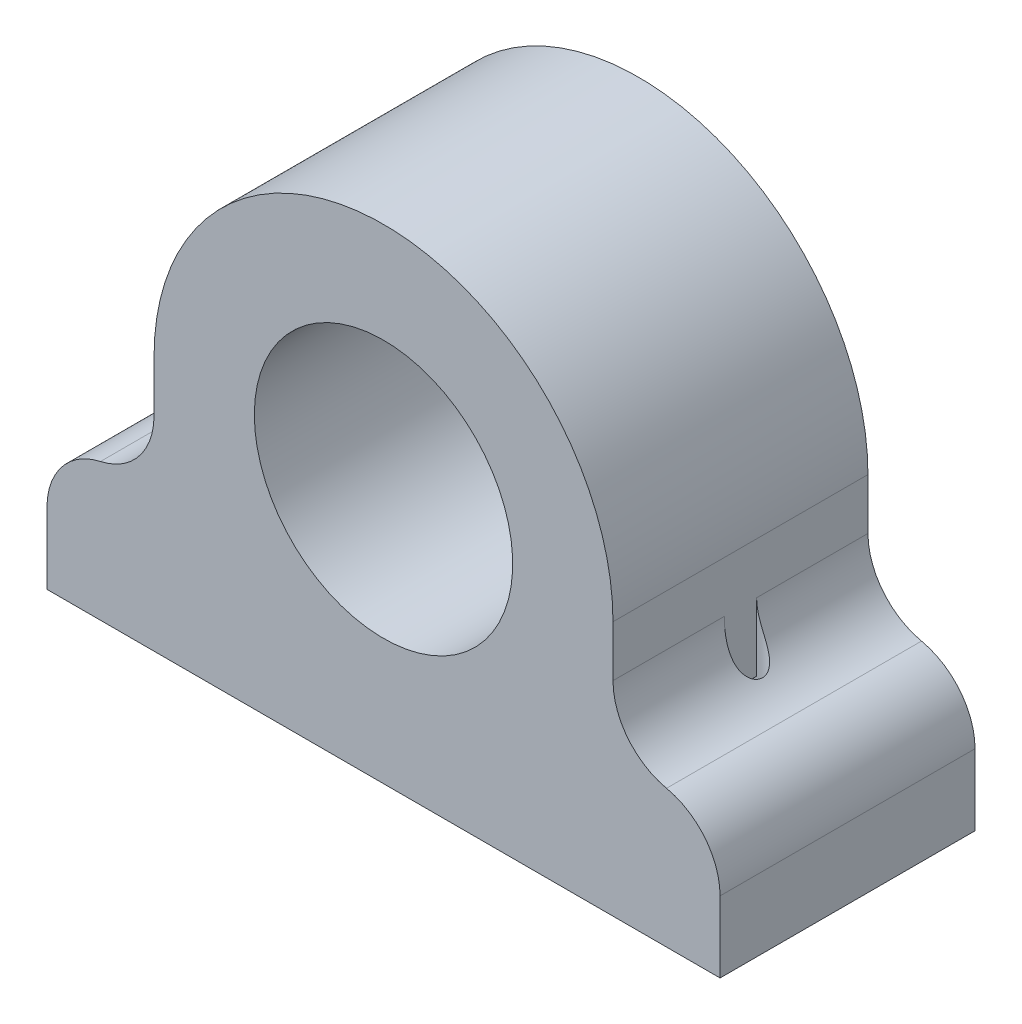
ISO-10303-21;
HEADER;
FILE_DESCRIPTION(('STEP AP214'),'2;1');
FILE_NAME('part.step','',(''),(''),'','','');
FILE_SCHEMA(('AUTOMOTIVE_DESIGN { 1 0 10303 214 1 1 1 1 }'));
ENDSEC;
DATA;
#1=APPLICATION_CONTEXT('core data for automotive mechanical design processes');
#2=APPLICATION_PROTOCOL_DEFINITION('international standard','automotive_design',2000,#1);
#3=PRODUCT_CONTEXT('',#1,'mechanical');
#4=PRODUCT('Part','Part','',(#3));
#5=PRODUCT_RELATED_PRODUCT_CATEGORY('part','',(#4));
#6=PRODUCT_DEFINITION_FORMATION('','',#4);
#7=PRODUCT_DEFINITION_CONTEXT('part definition',#1,'design');
#8=PRODUCT_DEFINITION('design','',#6,#7);
#9=PRODUCT_DEFINITION_SHAPE('','',#8);
#10=(LENGTH_UNIT() NAMED_UNIT(*) SI_UNIT(.MILLI.,.METRE.));
#11=(NAMED_UNIT(*) PLANE_ANGLE_UNIT() SI_UNIT($,.RADIAN.));
#12=(NAMED_UNIT(*) SI_UNIT($,.STERADIAN.) SOLID_ANGLE_UNIT());
#13=UNCERTAINTY_MEASURE_WITH_UNIT(LENGTH_MEASURE(1.E-05),#10,'distance_accuracy_value','');
#14=(GEOMETRIC_REPRESENTATION_CONTEXT(3) GLOBAL_UNCERTAINTY_ASSIGNED_CONTEXT((#13)) GLOBAL_UNIT_ASSIGNED_CONTEXT((#10,
#11,#12)) REPRESENTATION_CONTEXT('',''));
#15=CARTESIAN_POINT('',(0.,0.,0.));
#16=DIRECTION('',(0.,0.,1.));
#17=DIRECTION('',(1.,0.,0.));
#18=AXIS2_PLACEMENT_3D('',#15,#16,#17);
#19=CARTESIAN_POINT('',(0.,0.,9.525));
#20=DIRECTION('',(0.,0.,-1.));
#21=DIRECTION('',(-1.,0.,0.));
#22=AXIS2_PLACEMENT_3D('',#19,#20,#21);
#23=CYLINDRICAL_SURFACE('',#22,8.5725);
#24=CARTESIAN_POINT('',(0.,0.,0.));
#25=DIRECTION('',(0.,0.,1.));
#26=DIRECTION('',(-1.,0.,0.));
#27=AXIS2_PLACEMENT_3D('',#24,#25,#26);
#28=CIRCLE('',#27,8.5725);
#29=CARTESIAN_POINT('',(8.5725,0.,0.));
#30=VERTEX_POINT('',#29);
#31=CARTESIAN_POINT('',(-8.5725,0.,0.));
#32=VERTEX_POINT('',#31);
#33=EDGE_CURVE('E165',#30,#32,#28,.T.);
#34=ORIENTED_EDGE('',*,*,#33,.T.);
#35=DIRECTION('',(0.,0.,-1.));
#36=VECTOR('',#35,1.);
#37=CARTESIAN_POINT('',(-8.5725,0.,9.525));
#38=LINE('',#37,#36);
#39=CARTESIAN_POINT('',(-8.5725,0.,9.525));
#40=VERTEX_POINT('',#39);
#41=EDGE_CURVE('E183',#40,#32,#38,.T.);
#42=ORIENTED_EDGE('',*,*,#41,.F.);
#43=CARTESIAN_POINT('',(0.,0.,9.525));
#44=DIRECTION('',(0.,0.,1.));
#45=DIRECTION('',(-1.,0.,0.));
#46=AXIS2_PLACEMENT_3D('',#43,#44,#45);
#47=CIRCLE('',#46,8.5725);
#48=CARTESIAN_POINT('',(8.5725,0.,9.525));
#49=VERTEX_POINT('',#48);
#50=EDGE_CURVE('E161',#49,#40,#47,.T.);
#51=ORIENTED_EDGE('',*,*,#50,.F.);
#52=DIRECTION('',(0.,0.,-1.));
#53=VECTOR('',#52,1.);
#54=CARTESIAN_POINT('',(8.5725,0.,9.525));
#55=LINE('',#54,#53);
#56=EDGE_CURVE('E158',#49,#30,#55,.T.);
#57=ORIENTED_EDGE('',*,*,#56,.T.);
#58=EDGE_LOOP('',(#34,#42,#51,#57));
#59=FACE_BOUND('',#58,.T.);
#60=ADVANCED_FACE('F32',(#59),#23,.T.);
#61=CARTESIAN_POINT('',(-8.5725,0.,9.525));
#62=DIRECTION('',(1.,0.,0.));
#63=DIRECTION('',(0.,1.,0.));
#64=AXIS2_PLACEMENT_3D('',#61,#62,#63);
#65=PLANE('',#64);
#66=DIRECTION('',(0.,0.,1.));
#67=VECTOR('',#66,1.);
#68=CARTESIAN_POINT('',(-8.5725,-1.905,2.07837430355012));
#69=LINE('',#68,#67);
#70=CARTESIAN_POINT('',(-8.5725,-1.90500190223585,0.));
#71=VERTEX_POINT('',#70);
#72=CARTESIAN_POINT('',(-8.5725,-1.9050038044717,4.15674860710024));
#73=VERTEX_POINT('',#72);
#74=EDGE_CURVE('E202',#71,#73,#69,.T.);
#75=ORIENTED_EDGE('',*,*,#74,.T.);
#76=DIRECTION('',(0.,1.,0.));
#77=VECTOR('',#76,1.);
#78=CARTESIAN_POINT('',(-8.5725,-1.9050038044717,4.15674860710024));
#79=LINE('',#78,#77);
#80=CARTESIAN_POINT('',(-8.5725,-4.445,4.15674860710024));
#81=VERTEX_POINT('',#80);
#82=EDGE_CURVE('E205',#73,#81,#79,.F.);
#83=ORIENTED_EDGE('',*,*,#82,.T.);
#84=DIRECTION('',(0.,0.,-1.));
#85=VECTOR('',#84,1.);
#86=CARTESIAN_POINT('',(-8.5725,-4.445,9.525));
#87=LINE('',#86,#85);
#88=CARTESIAN_POINT('',(-8.5725,-4.445,5.36825139289976));
#89=VERTEX_POINT('',#88);
#90=EDGE_CURVE('E180',#89,#81,#87,.T.);
#91=ORIENTED_EDGE('',*,*,#90,.F.);
#92=DIRECTION('',(0.,1.,0.));
#93=VECTOR('',#92,1.);
#94=CARTESIAN_POINT('',(-8.5725,-4.445,5.36825139289976));
#95=LINE('',#94,#93);
#96=CARTESIAN_POINT('',(-8.5725,-1.905,5.36825139289976));
#97=VERTEX_POINT('',#96);
#98=EDGE_CURVE('E199',#89,#97,#95,.T.);
#99=ORIENTED_EDGE('',*,*,#98,.T.);
#100=DIRECTION('',(0.,0.,-1.));
#101=VECTOR('',#100,1.);
#102=CARTESIAN_POINT('',(-8.5725,-1.905,9.525));
#103=LINE('',#102,#101);
#104=CARTESIAN_POINT('',(-8.5725,-1.905,9.525));
#105=VERTEX_POINT('',#104);
#106=EDGE_CURVE('E197',#97,#105,#103,.F.);
#107=ORIENTED_EDGE('',*,*,#106,.T.);
#108=DIRECTION('',(0.,-1.,0.));
#109=VECTOR('',#108,1.);
#110=CARTESIAN_POINT('',(-8.5725,0.,9.525));
#111=LINE('',#110,#109);
#112=EDGE_CURVE('E156',#40,#105,#111,.T.);
#113=ORIENTED_EDGE('',*,*,#112,.F.);
#114=ORIENTED_EDGE('',*,*,#41,.T.);
#115=DIRECTION('',(0.,-1.,0.));
#116=VECTOR('',#115,1.);
#117=CARTESIAN_POINT('',(-8.5725,0.,0.));
#118=LINE('',#117,#116);
#119=EDGE_CURVE('E168',#32,#71,#118,.T.);
#120=ORIENTED_EDGE('',*,*,#119,.T.);
#121=EDGE_LOOP('',(#75,#83,#91,#99,#107,#113,#114,#120));
#122=FACE_BOUND('',#121,.T.);
#123=ADVANCED_FACE('F277',(#122),#65,.F.);
#124=CARTESIAN_POINT('',(-18.7325,-9.525,9.525));
#125=DIRECTION('',(0.,1.,0.));
#126=DIRECTION('',(0.,0.,1.));
#127=AXIS2_PLACEMENT_3D('',#124,#125,#126);
#128=PLANE('',#127);
#129=CARTESIAN_POINT('',(8.763,-9.525,4.7625));
#130=DIRECTION('',(0.,1.,0.));
#131=DIRECTION('',(-1.,0.,0.));
#132=AXIS2_PLACEMENT_3D('',#129,#130,#131);
#133=CIRCLE('',#132,0.635000000000001);
#134=CARTESIAN_POINT('',(8.128,-9.525,4.7625));
#135=VERTEX_POINT('',#134);
#136=EDGE_CURVE('E297',#135,#135,#133,.T.);
#137=ORIENTED_EDGE('',*,*,#136,.T.);
#138=EDGE_LOOP('',(#137));
#139=FACE_BOUND('',#138,.T.);
#140=CARTESIAN_POINT('',(-8.763,-9.52500000000001,4.7625));
#141=DIRECTION('',(0.,1.,0.));
#142=DIRECTION('',(-1.,0.,0.));
#143=AXIS2_PLACEMENT_3D('',#140,#141,#142);
#144=CIRCLE('',#143,0.635000000000001);
#145=CARTESIAN_POINT('',(-9.398,-9.52500000000001,4.7625));
#146=VERTEX_POINT('',#145);
#147=EDGE_CURVE('E296',#146,#146,#144,.T.);
#148=ORIENTED_EDGE('',*,*,#147,.T.);
#149=EDGE_LOOP('',(#148));
#150=FACE_BOUND('',#149,.T.);
#151=DIRECTION('',(1.,0.,0.));
#152=VECTOR('',#151,1.);
#153=CARTESIAN_POINT('',(-18.7325,-9.525,0.));
#154=LINE('',#153,#152);
#155=CARTESIAN_POINT('',(-12.573,-9.525,0.));
#156=VERTEX_POINT('',#155);
#157=CARTESIAN_POINT('',(12.573,-9.525,0.));
#158=VERTEX_POINT('',#157);
#159=EDGE_CURVE('E150',#156,#158,#154,.T.);
#160=ORIENTED_EDGE('',*,*,#159,.T.);
#161=DIRECTION('',(0.,0.,-1.));
#162=VECTOR('',#161,1.);
#163=CARTESIAN_POINT('',(12.573,-9.525,11.6569279405596));
#164=LINE('',#163,#162);
#165=CARTESIAN_POINT('',(12.573,-9.525,9.525));
#166=VERTEX_POINT('',#165);
#167=EDGE_CURVE('E135',#166,#158,#164,.T.);
#168=ORIENTED_EDGE('',*,*,#167,.F.);
#169=DIRECTION('',(1.,0.,0.));
#170=VECTOR('',#169,1.);
#171=CARTESIAN_POINT('',(-18.7325,-9.525,9.525));
#172=LINE('',#171,#170);
#173=CARTESIAN_POINT('',(-12.573,-9.525,9.525));
#174=VERTEX_POINT('',#173);
#175=EDGE_CURVE('E148',#174,#166,#172,.T.);
#176=ORIENTED_EDGE('',*,*,#175,.F.);
#177=DIRECTION('',(0.,0.,1.));
#178=VECTOR('',#177,1.);
#179=CARTESIAN_POINT('',(-12.573,-9.525,11.6569279405596));
#180=LINE('',#179,#178);
#181=EDGE_CURVE('E141',#156,#174,#180,.T.);
#182=ORIENTED_EDGE('',*,*,#181,.F.);
#183=EDGE_LOOP('',(#160,#168,#176,#182));
#184=FACE_BOUND('',#183,.T.);
#185=ADVANCED_FACE('F146',(#139,#150,#184),#128,.F.);
#186=CARTESIAN_POINT('',(8.5725,-4.445,9.525));
#187=DIRECTION('',(-1.,0.,0.));
#188=DIRECTION('',(0.,-1.,0.));
#189=AXIS2_PLACEMENT_3D('',#186,#187,#188);
#190=PLANE('',#189);
#191=DIRECTION('',(0.,1.,0.));
#192=VECTOR('',#191,1.);
#193=CARTESIAN_POINT('',(8.5725,-4.445,4.15674860710024));
#194=LINE('',#193,#192);
#195=CARTESIAN_POINT('',(8.5725,-4.445,4.15674860710024));
#196=VERTEX_POINT('',#195);
#197=CARTESIAN_POINT('',(8.5725,-1.905,4.15674860710024));
#198=VERTEX_POINT('',#197);
#199=EDGE_CURVE('E191',#196,#198,#194,.T.);
#200=ORIENTED_EDGE('',*,*,#199,.T.);
#201=DIRECTION('',(0.,0.,-1.));
#202=VECTOR('',#201,1.);
#203=CARTESIAN_POINT('',(8.5725,-1.905,0.));
#204=LINE('',#203,#202);
#205=CARTESIAN_POINT('',(8.5725,-1.905,0.));
#206=VERTEX_POINT('',#205);
#207=EDGE_CURVE('E194',#198,#206,#204,.T.);
#208=ORIENTED_EDGE('',*,*,#207,.T.);
#209=DIRECTION('',(0.,1.,0.));
#210=VECTOR('',#209,1.);
#211=CARTESIAN_POINT('',(8.5725,-4.445,0.));
#212=LINE('',#211,#210);
#213=EDGE_CURVE('E173',#206,#30,#212,.T.);
#214=ORIENTED_EDGE('',*,*,#213,.T.);
#215=ORIENTED_EDGE('',*,*,#56,.F.);
#216=DIRECTION('',(0.,1.,0.));
#217=VECTOR('',#216,1.);
#218=CARTESIAN_POINT('',(8.5725,-4.445,9.525));
#219=LINE('',#218,#217);
#220=CARTESIAN_POINT('',(8.5725,-1.9050019022359,9.525));
#221=VERTEX_POINT('',#220);
#222=EDGE_CURVE('E155',#221,#49,#219,.T.);
#223=ORIENTED_EDGE('',*,*,#222,.F.);
#224=DIRECTION('',(0.,0.,1.));
#225=VECTOR('',#224,1.);
#226=CARTESIAN_POINT('',(8.5725,-1.905,7.44662569644988));
#227=LINE('',#226,#225);
#228=CARTESIAN_POINT('',(8.5725,-1.9050038044718,5.36825139289976));
#229=VERTEX_POINT('',#228);
#230=EDGE_CURVE('E186',#221,#229,#227,.F.);
#231=ORIENTED_EDGE('',*,*,#230,.T.);
#232=DIRECTION('',(0.,1.,0.));
#233=VECTOR('',#232,1.);
#234=CARTESIAN_POINT('',(8.5725,-1.9050038044718,5.36825139289976));
#235=LINE('',#234,#233);
#236=CARTESIAN_POINT('',(8.5725,-4.445,5.36825139289976));
#237=VERTEX_POINT('',#236);
#238=EDGE_CURVE('E189',#229,#237,#235,.F.);
#239=ORIENTED_EDGE('',*,*,#238,.T.);
#240=DIRECTION('',(0.,0.,-1.));
#241=VECTOR('',#240,1.);
#242=CARTESIAN_POINT('',(8.5725,-4.445,9.525));
#243=LINE('',#242,#241);
#244=EDGE_CURVE('E177',#237,#196,#243,.T.);
#245=ORIENTED_EDGE('',*,*,#244,.T.);
#246=EDGE_LOOP('',(#200,#208,#214,#215,#223,#231,#239,#245));
#247=FACE_BOUND('',#246,.T.);
#248=ADVANCED_FACE('F268',(#247),#190,.F.);
#249=CARTESIAN_POINT('',(0.,0.,9.525));
#250=DIRECTION('',(0.,0.,-1.));
#251=DIRECTION('',(-1.,0.,0.));
#252=AXIS2_PLACEMENT_3D('',#249,#250,#251);
#253=PLANE('',#252);
#254=CARTESIAN_POINT('',(0.,0.,9.525));
#255=DIRECTION('',(0.,0.,-1.));
#256=DIRECTION('',(-1.,0.,0.));
#257=AXIS2_PLACEMENT_3D('',#254,#255,#256);
#258=CIRCLE('',#257,4.826);
#259=CARTESIAN_POINT('',(-4.826,0.,9.525));
#260=VERTEX_POINT('',#259);
#261=EDGE_CURVE('E307',#260,#260,#258,.T.);
#262=ORIENTED_EDGE('',*,*,#261,.T.);
#263=EDGE_LOOP('',(#262));
#264=FACE_BOUND('',#263,.T.);
#265=DIRECTION('',(0.,1.,0.));
#266=VECTOR('',#265,1.);
#267=CARTESIAN_POINT('',(12.573,0.,9.525));
#268=LINE('',#267,#266);
#269=CARTESIAN_POINT('',(12.573,-6.86897821812304,9.525));
#270=VERTEX_POINT('',#269);
#271=EDGE_CURVE('E131',#166,#270,#268,.T.);
#272=ORIENTED_EDGE('',*,*,#271,.T.);
#273=CARTESIAN_POINT('',(10.033,-6.86897821812304,9.525));
#274=DIRECTION('',(0.,0.,-1.));
#275=DIRECTION('',(-1.,0.,0.));
#276=AXIS2_PLACEMENT_3D('',#273,#274,#275);
#277=CIRCLE('',#276,2.54);
#278=CARTESIAN_POINT('',(10.57275,-4.38698910906152,9.525));
#279=VERTEX_POINT('',#278);
#280=EDGE_CURVE('E327',#270,#279,#277,.F.);
#281=ORIENTED_EDGE('',*,*,#280,.T.);
#282=CARTESIAN_POINT('',(11.1125,-1.905,9.525));
#283=DIRECTION('',(0.,0.,-1.));
#284=DIRECTION('',(-1.,0.,0.));
#285=AXIS2_PLACEMENT_3D('',#282,#283,#284);
#286=CIRCLE('',#285,2.54);
#287=EDGE_CURVE('E210',#279,#221,#286,.T.);
#288=ORIENTED_EDGE('',*,*,#287,.T.);
#289=ORIENTED_EDGE('',*,*,#222,.T.);
#290=ORIENTED_EDGE('',*,*,#50,.T.);
#291=ORIENTED_EDGE('',*,*,#112,.T.);
#292=CARTESIAN_POINT('',(-11.1125,-1.905,9.525));
#293=DIRECTION('',(0.,0.,-1.));
#294=DIRECTION('',(-1.,0.,0.));
#295=AXIS2_PLACEMENT_3D('',#292,#293,#294);
#296=CIRCLE('',#295,2.54);
#297=CARTESIAN_POINT('',(-10.57275,-4.38698910906152,9.525));
#298=VERTEX_POINT('',#297);
#299=EDGE_CURVE('E244',#105,#298,#296,.T.);
#300=ORIENTED_EDGE('',*,*,#299,.T.);
#301=CARTESIAN_POINT('',(-10.033,-6.86897821812304,9.525));
#302=DIRECTION('',(0.,0.,-1.));
#303=DIRECTION('',(-1.,0.,0.));
#304=AXIS2_PLACEMENT_3D('',#301,#302,#303);
#305=CIRCLE('',#304,2.54);
#306=CARTESIAN_POINT('',(-12.573,-6.86897821812304,9.525));
#307=VERTEX_POINT('',#306);
#308=EDGE_CURVE('E47',#298,#307,#305,.F.);
#309=ORIENTED_EDGE('',*,*,#308,.T.);
#310=DIRECTION('',(0.,-1.,0.));
#311=VECTOR('',#310,1.);
#312=CARTESIAN_POINT('',(-12.573,0.,9.525));
#313=LINE('',#312,#311);
#314=EDGE_CURVE('E153',#307,#174,#313,.T.);
#315=ORIENTED_EDGE('',*,*,#314,.T.);
#316=ORIENTED_EDGE('',*,*,#175,.T.);
#317=EDGE_LOOP('',(#272,#281,#288,#289,#290,#291,#300,#309,#315,#316));
#318=FACE_BOUND('',#317,.T.);
#319=ADVANCED_FACE('F152',(#264,#318),#253,.F.);
#320=CARTESIAN_POINT('',(0.,0.,0.));
#321=DIRECTION('',(0.,0.,-1.));
#322=DIRECTION('',(-1.,0.,0.));
#323=AXIS2_PLACEMENT_3D('',#320,#321,#322);
#324=PLANE('',#323);
#325=CARTESIAN_POINT('',(11.1125,-1.905,0.));
#326=DIRECTION('',(0.,0.,-1.));
#327=DIRECTION('',(-1.,0.,0.));
#328=AXIS2_PLACEMENT_3D('',#325,#326,#327);
#329=CIRCLE('',#328,2.54);
#330=CARTESIAN_POINT('',(10.57275,-4.38698910906152,0.));
#331=VERTEX_POINT('',#330);
#332=EDGE_CURVE('E207',#206,#331,#329,.F.);
#333=ORIENTED_EDGE('',*,*,#332,.T.);
#334=CARTESIAN_POINT('',(10.033,-6.86897821812304,0.));
#335=DIRECTION('',(0.,0.,-1.));
#336=DIRECTION('',(-1.,0.,0.));
#337=AXIS2_PLACEMENT_3D('',#334,#335,#336);
#338=CIRCLE('',#337,2.54);
#339=CARTESIAN_POINT('',(12.573,-6.86897821812304,0.));
#340=VERTEX_POINT('',#339);
#341=EDGE_CURVE('E332',#331,#340,#338,.T.);
#342=ORIENTED_EDGE('',*,*,#341,.T.);
#343=DIRECTION('',(0.,1.,0.));
#344=VECTOR('',#343,1.);
#345=CARTESIAN_POINT('',(12.573,0.,0.));
#346=LINE('',#345,#344);
#347=EDGE_CURVE('E338',#158,#340,#346,.T.);
#348=ORIENTED_EDGE('',*,*,#347,.F.);
#349=ORIENTED_EDGE('',*,*,#159,.F.);
#350=DIRECTION('',(0.,-1.,0.));
#351=VECTOR('',#350,1.);
#352=CARTESIAN_POINT('',(-12.573,0.,0.));
#353=LINE('',#352,#351);
#354=CARTESIAN_POINT('',(-12.573,-6.86897821812304,0.));
#355=VERTEX_POINT('',#354);
#356=EDGE_CURVE('E339',#355,#156,#353,.T.);
#357=ORIENTED_EDGE('',*,*,#356,.F.);
#358=CARTESIAN_POINT('',(-10.033,-6.86897821812304,0.));
#359=DIRECTION('',(0.,0.,-1.));
#360=DIRECTION('',(-1.,0.,0.));
#361=AXIS2_PLACEMENT_3D('',#358,#359,#360);
#362=CIRCLE('',#361,2.54);
#363=CARTESIAN_POINT('',(-10.57275,-4.38698910906152,0.));
#364=VERTEX_POINT('',#363);
#365=EDGE_CURVE('E326',#355,#364,#362,.T.);
#366=ORIENTED_EDGE('',*,*,#365,.T.);
#367=CARTESIAN_POINT('',(-11.1125,-1.905,0.));
#368=DIRECTION('',(0.,0.,-1.));
#369=DIRECTION('',(-1.,0.,0.));
#370=AXIS2_PLACEMENT_3D('',#367,#368,#369);
#371=CIRCLE('',#370,2.54);
#372=EDGE_CURVE('E219',#364,#71,#371,.F.);
#373=ORIENTED_EDGE('',*,*,#372,.T.);
#374=ORIENTED_EDGE('',*,*,#119,.F.);
#375=ORIENTED_EDGE('',*,*,#33,.F.);
#376=ORIENTED_EDGE('',*,*,#213,.F.);
#377=EDGE_LOOP('',(#333,#342,#348,#349,#357,#366,#373,#374,#375,#376));
#378=FACE_BOUND('',#377,.T.);
#379=CARTESIAN_POINT('',(0.,0.,0.));
#380=DIRECTION('',(0.,0.,-1.));
#381=DIRECTION('',(-1.,0.,0.));
#382=AXIS2_PLACEMENT_3D('',#379,#380,#381);
#383=CIRCLE('',#382,6.4135);
#384=CARTESIAN_POINT('',(-6.4135,0.,0.));
#385=VERTEX_POINT('',#384);
#386=EDGE_CURVE('E310',#385,#385,#383,.T.);
#387=ORIENTED_EDGE('',*,*,#386,.F.);
#388=EDGE_LOOP('',(#387));
#389=FACE_BOUND('',#388,.T.);
#390=ADVANCED_FACE('F264',(#378,#389),#324,.T.);
#391=CARTESIAN_POINT('',(0.,0.,1.5875));
#392=DIRECTION('',(0.,0.,-1.));
#393=DIRECTION('',(-1.,0.,0.));
#394=AXIS2_PLACEMENT_3D('',#391,#392,#393);
#395=CYLINDRICAL_SURFACE('',#394,6.4135);
#396=CARTESIAN_POINT('',(0.,0.,1.5875));
#397=DIRECTION('',(0.,0.,-1.));
#398=DIRECTION('',(-1.,0.,0.));
#399=AXIS2_PLACEMENT_3D('',#396,#397,#398);
#400=CIRCLE('',#399,6.4135);
#401=CARTESIAN_POINT('',(-6.4135,0.,1.5875));
#402=VERTEX_POINT('',#401);
#403=EDGE_CURVE('E169',#402,#402,#400,.T.);
#404=ORIENTED_EDGE('',*,*,#403,.F.);
#405=EDGE_LOOP('',(#404));
#406=FACE_BOUND('',#405,.T.);
#407=ORIENTED_EDGE('',*,*,#386,.T.);
#408=EDGE_LOOP('',(#407));
#409=FACE_BOUND('',#408,.T.);
#410=ADVANCED_FACE('F260',(#406,#409),#395,.F.);
#411=CARTESIAN_POINT('',(0.,0.,1.5875));
#412=DIRECTION('',(0.,0.,-1.));
#413=DIRECTION('',(-1.,0.,0.));
#414=AXIS2_PLACEMENT_3D('',#411,#412,#413);
#415=PLANE('',#414);
#416=CARTESIAN_POINT('',(0.,0.,1.5875));
#417=DIRECTION('',(0.,0.,-1.));
#418=DIRECTION('',(-1.,0.,0.));
#419=AXIS2_PLACEMENT_3D('',#416,#417,#418);
#420=CIRCLE('',#419,4.826);
#421=CARTESIAN_POINT('',(-4.826,0.,1.5875));
#422=VERTEX_POINT('',#421);
#423=EDGE_CURVE('E300',#422,#422,#420,.T.);
#424=ORIENTED_EDGE('',*,*,#423,.F.);
#425=EDGE_LOOP('',(#424));
#426=FACE_BOUND('',#425,.T.);
#427=ORIENTED_EDGE('',*,*,#403,.T.);
#428=EDGE_LOOP('',(#427));
#429=FACE_BOUND('',#428,.T.);
#430=ADVANCED_FACE('F256',(#426,#429),#415,.T.);
#431=CARTESIAN_POINT('',(0.,0.,9.525));
#432=DIRECTION('',(0.,0.,-1.));
#433=DIRECTION('',(-1.,0.,0.));
#434=AXIS2_PLACEMENT_3D('',#431,#432,#433);
#435=CYLINDRICAL_SURFACE('',#434,4.826);
#436=ORIENTED_EDGE('',*,*,#261,.F.);
#437=EDGE_LOOP('',(#436));
#438=FACE_BOUND('',#437,.T.);
#439=ORIENTED_EDGE('',*,*,#423,.T.);
#440=EDGE_LOOP('',(#439));
#441=FACE_BOUND('',#440,.T.);
#442=ADVANCED_FACE('F253',(#438,#441),#435,.F.);
#443=CARTESIAN_POINT('',(-8.763,-4.445,4.7625));
#444=DIRECTION('',(0.,1.,0.));
#445=DIRECTION('',(-1.,0.,0.));
#446=AXIS2_PLACEMENT_3D('',#443,#444,#445);
#447=PLANE('',#446);
#448=CARTESIAN_POINT('',(-8.763,-4.445,4.7625));
#449=DIRECTION('',(0.,1.,0.));
#450=DIRECTION('',(-1.,0.,0.));
#451=AXIS2_PLACEMENT_3D('',#448,#449,#450);
#452=CIRCLE('',#451,0.635000000000001);
#453=EDGE_CURVE('E295',#89,#81,#452,.T.);
#454=ORIENTED_EDGE('',*,*,#453,.F.);
#455=ORIENTED_EDGE('',*,*,#90,.T.);
#456=EDGE_LOOP('',(#454,#455));
#457=FACE_BOUND('',#456,.T.);
#458=ADVANCED_FACE('F251',(#457),#447,.F.);
#459=CARTESIAN_POINT('',(-8.763,-9.52500000000001,4.7625));
#460=DIRECTION('',(0.,1.,0.));
#461=DIRECTION('',(-1.,0.,0.));
#462=AXIS2_PLACEMENT_3D('',#459,#460,#461);
#463=CYLINDRICAL_SURFACE('',#462,0.635000000000001);
#464=ORIENTED_EDGE('',*,*,#147,.F.);
#465=EDGE_LOOP('',(#464));
#466=FACE_BOUND('',#465,.T.);
#467=ORIENTED_EDGE('',*,*,#453,.T.);
#468=ORIENTED_EDGE('',*,*,#82,.F.);
#469=CARTESIAN_POINT('',(-8.5725,-1.9050038044717,4.15674860710024));
#470=CARTESIAN_POINT('',(-8.57249988677581,-1.93999750200674,4.1567532580896));
#471=CARTESIAN_POINT('',(-8.57322334750189,-1.97498681234913,4.1565206169252));
#472=CARTESIAN_POINT('',(-8.57611425737465,-2.04489708589561,4.15562100686838));
#473=CARTESIAN_POINT('',(-8.5782815773349,-2.07981805493407,4.1549540768332));
#474=CARTESIAN_POINT('',(-8.58694381556002,-2.18438683465711,4.15236244888043));
#475=CARTESIAN_POINT('',(-8.5955990142836,-2.2538522689427,4.14984688771824));
#476=CARTESIAN_POINT('',(-8.61869370126348,-2.39233719849741,4.14399976709207));
#477=CARTESIAN_POINT('',(-8.63317843103945,-2.46134881204359,4.14066190644435));
#478=CARTESIAN_POINT('',(-8.66782484257797,-2.59791346449246,4.13442750709579));
#479=CARTESIAN_POINT('',(-8.68798441935255,-2.66546703424684,4.13153080536735));
#480=CARTESIAN_POINT('',(-8.74043403340182,-2.81773301596061,4.12720526441434));
#481=CARTESIAN_POINT('',(-8.77454332148953,-2.90186392753383,4.12642781615542));
#482=CARTESIAN_POINT('',(-8.83213959461017,-3.02464164922766,4.1309864202533));
#483=CARTESIAN_POINT('',(-8.85237437398943,-3.06493842226591,4.13345191745408));
#484=CARTESIAN_POINT('',(-8.8948469194998,-3.14420681261746,4.14096376362402));
#485=CARTESIAN_POINT('',(-8.9170837300964,-3.1831790500016,4.14600888670674));
#486=CARTESIAN_POINT('',(-8.9688577116264,-3.26861633866458,4.16105182116498));
#487=CARTESIAN_POINT('',(-8.99886974608999,-3.3146469302622,4.17194493916606));
#488=CARTESIAN_POINT('',(-9.06073947708025,-3.40325948355183,4.20059629741526));
#489=CARTESIAN_POINT('',(-9.09259506211926,-3.4458452616836,4.21834681093574));
#490=CARTESIAN_POINT('',(-9.14802502378468,-3.51555029661399,4.25673683074094));
#491=CARTESIAN_POINT('',(-9.17156597435441,-3.5437851019324,4.27537728124539));
#492=CARTESIAN_POINT('',(-9.21762310401454,-3.59682364041218,4.31806240075403));
#493=CARTESIAN_POINT('',(-9.24014076988948,-3.62163246575304,4.34209890664156));
#494=CARTESIAN_POINT('',(-9.27797798899261,-3.66190675948129,4.3900223255516));
#495=CARTESIAN_POINT('',(-9.29379459519226,-3.67822892982098,4.41279166563101));
#496=CARTESIAN_POINT('',(-9.32298284396631,-3.70768073790458,4.46174343952413));
#497=CARTESIAN_POINT('',(-9.3363553173965,-3.72081146104799,4.48792470828675));
#498=CARTESIAN_POINT('',(-9.35980432261042,-3.74345806502858,4.54348997839502));
#499=CARTESIAN_POINT('',(-9.36985311205421,-3.75294362124381,4.57289833680984));
#500=CARTESIAN_POINT('',(-9.38562785683121,-3.76769482627628,4.63386189273106));
#501=CARTESIAN_POINT('',(-9.39135722977118,-3.77296381153025,4.66541537137932));
#502=CARTESIAN_POINT('',(-9.39750899990835,-3.77861144485791,4.72509560212473));
#503=CARTESIAN_POINT('',(-9.3985450924703,-3.7795558027071,4.75310762850362));
#504=CARTESIAN_POINT('',(-9.39691480113141,-3.7780640637388,4.80892721011076));
#505=CARTESIAN_POINT('',(-9.39424974901619,-3.7756291828755,4.83673483526989));
#506=CARTESIAN_POINT('',(-9.38565487946169,-3.76769616180962,4.88982218408501));
#507=CARTESIAN_POINT('',(-9.37990672976402,-3.76236828979798,4.91515763606461));
#508=CARTESIAN_POINT('',(-9.36563796307695,-3.748954550453,4.96425842206743));
#509=CARTESIAN_POINT('',(-9.35711718633507,-3.74086852419979,4.98802366552386));
#510=CARTESIAN_POINT('',(-9.33720648971063,-3.72162722244607,5.03489397954784));
#511=CARTESIAN_POINT('',(-9.32567582282869,-3.71031772752053,5.05787526092816));
#512=CARTESIAN_POINT('',(-9.30066918357337,-3.68522020124322,5.10127051761316));
#513=CARTESIAN_POINT('',(-9.2871921001895,-3.67143075322937,5.12168301412307));
#514=CARTESIAN_POINT('',(-9.25231494592385,-3.63479973164021,5.16870893883055));
#515=CARTESIAN_POINT('',(-9.23014317692759,-3.61072924156078,5.19379652189517));
#516=CARTESIAN_POINT('',(-9.18452161692394,-3.55899480271716,5.23849334610801));
#517=CARTESIAN_POINT('',(-9.16106929703879,-3.53132358230858,5.25809124130656));
#518=CARTESIAN_POINT('',(-9.10297115238463,-3.45947793501387,5.30053696052363));
#519=CARTESIAN_POINT('',(-9.06827176400784,-3.41368306789223,5.32054573269098));
#520=CARTESIAN_POINT('',(-9.00096260470065,-3.31796237991058,5.35240741848008));
#521=CARTESIAN_POINT('',(-8.96835716738094,-3.26802845272999,5.36424388278003));
#522=CARTESIAN_POINT('',(-8.9111150313003,-3.17310636119522,5.38058511626069));
#523=CARTESIAN_POINT('',(-8.8860218211762,-3.12852753359622,5.38593352428181));
#524=CARTESIAN_POINT('',(-8.83847105425716,-3.03770582162697,5.39345899002146));
#525=CARTESIAN_POINT('',(-8.81601536406829,-2.99146178865238,5.39563381404209));
#526=CARTESIAN_POINT('',(-8.77386929280904,-2.89750569403822,5.39775837817331));
#527=CARTESIAN_POINT('',(-8.75418856298007,-2.84978917979328,5.3977005358389));
#528=CARTESIAN_POINT('',(-8.71777452349914,-2.75326410975878,5.39614934182811));
#529=CARTESIAN_POINT('',(-8.70104187028405,-2.70445531347484,5.3946556709181));
#530=CARTESIAN_POINT('',(-8.66700024184668,-2.5943385279386,5.39048825549111));
#531=CARTESIAN_POINT('',(-8.65048246278825,-2.53279238054382,5.38761951332908));
#532=CARTESIAN_POINT('',(-8.62211629357394,-2.40863235062896,5.38184334658084));
#533=CARTESIAN_POINT('',(-8.61026846977704,-2.34601833956149,5.37893591734695));
#534=CARTESIAN_POINT('',(-8.59138189890182,-2.22052561722647,5.3739473454923));
#535=CARTESIAN_POINT('',(-8.58430639547545,-2.15765277103205,5.37185994040313));
#536=CARTESIAN_POINT('',(-8.57722550060672,-2.06306368580857,5.36972162479451));
#537=CARTESIAN_POINT('',(-8.57545392831216,-2.03148191451117,5.36917430958837));
#538=CARTESIAN_POINT('',(-8.57309110669265,-1.96826789013839,5.36843764387217));
#539=CARTESIAN_POINT('',(-8.57249994103039,-1.93663563364382,5.36824831873512));
#540=CARTESIAN_POINT('',(-8.57249999999999,-1.90499999999995,5.36825139290114));
#541=B_SPLINE_CURVE_WITH_KNOTS('',3,(#469,#470,#471,#472,#473,#474,#475,#476,#477,#478,#479,
#480,#481,#482,#483,#484,#485,#486,#487,#488,#489,#490,#491,#492,#493,#494,#495,#496,#497,#498,
#499,#500,#501,#502,#503,#504,#505,#506,#507,#508,#509,#510,#511,#512,#513,#514,#515,#516,#517,
#518,#519,#520,#521,#522,#523,#524,#525,#526,#527,#528,#529,#530,#531,#532,#533,#534,#535,#536,
#537,#538,#539,#540),.UNSPECIFIED.,.F.,.F.,(4,2,2,2,2,2,2,2,2,2,2,2,2,2,2,2,2,2,2,2,2,2,2,2,2,2,
2,2,2,2,2,2,2,2,2,4),(0.,0.104964307229694,0.209919224249367,0.419793924247354,
0.631329823086263,0.84278735944359,1.11435870409693,1.24972863944019,1.38503430416601,
1.55266719410491,1.7201117481776,1.84336156698293,1.96642617590695,2.06256907183226,
2.15867922401301,2.25557246011065,2.35238895169511,2.43609214967092,2.51976523646581,
2.59897655241172,2.67819243314193,2.76213014584448,2.84611596077799,2.96912616448134,
3.09238875769776,3.27388719970656,3.45574990726812,3.60983810492123,3.76403470391113,
3.9187550218923,4.07350974743023,4.26468638353074,4.45588619786459,4.64559604407505,
4.74048351887012,4.83537771868748),.UNSPECIFIED.);
#542=EDGE_CURVE('E238',#73,#97,#541,.T.);
#543=ORIENTED_EDGE('',*,*,#542,.T.);
#544=ORIENTED_EDGE('',*,*,#98,.F.);
#545=EDGE_LOOP('',(#467,#468,#543,#544));
#546=FACE_BOUND('',#545,.T.);
#547=ADVANCED_FACE('F246',(#466,#546),#463,.F.);
#548=CARTESIAN_POINT('',(8.763,-4.445,4.7625));
#549=DIRECTION('',(0.,1.,0.));
#550=DIRECTION('',(-1.,0.,0.));
#551=AXIS2_PLACEMENT_3D('',#548,#549,#550);
#552=PLANE('',#551);
#553=CARTESIAN_POINT('',(8.763,-4.445,4.7625));
#554=DIRECTION('',(0.,1.,0.));
#555=DIRECTION('',(-1.,0.,0.));
#556=AXIS2_PLACEMENT_3D('',#553,#554,#555);
#557=CIRCLE('',#556,0.635000000000001);
#558=EDGE_CURVE('E303',#196,#237,#557,.T.);
#559=ORIENTED_EDGE('',*,*,#558,.F.);
#560=ORIENTED_EDGE('',*,*,#244,.F.);
#561=EDGE_LOOP('',(#559,#560));
#562=FACE_BOUND('',#561,.T.);
#563=ADVANCED_FACE('F250',(#562),#552,.F.);
#564=CARTESIAN_POINT('',(8.763,-9.525,4.7625));
#565=DIRECTION('',(0.,1.,0.));
#566=DIRECTION('',(-1.,0.,0.));
#567=AXIS2_PLACEMENT_3D('',#564,#565,#566);
#568=CYLINDRICAL_SURFACE('',#567,0.635000000000001);
#569=ORIENTED_EDGE('',*,*,#136,.F.);
#570=EDGE_LOOP('',(#569));
#571=FACE_BOUND('',#570,.T.);
#572=ORIENTED_EDGE('',*,*,#558,.T.);
#573=ORIENTED_EDGE('',*,*,#238,.F.);
#574=CARTESIAN_POINT('',(8.5725,-1.9050038044718,5.36825139289976));
#575=CARTESIAN_POINT('',(8.57249988677581,-1.93999750200684,5.3682467419104));
#576=CARTESIAN_POINT('',(8.5732233475019,-1.97498681234923,5.3684793830748));
#577=CARTESIAN_POINT('',(8.57611425737465,-2.04489708589571,5.36937899313162));
#578=CARTESIAN_POINT('',(8.5782815773349,-2.07981805493417,5.3700459231668));
#579=CARTESIAN_POINT('',(8.58694381556003,-2.18438683465721,5.37263755111957));
#580=CARTESIAN_POINT('',(8.59559901428361,-2.2538522689428,5.37515311228177));
#581=CARTESIAN_POINT('',(8.6186937012635,-2.39233719849751,5.38100023290793));
#582=CARTESIAN_POINT('',(8.63317843103947,-2.46134881204369,5.38433809355565));
#583=CARTESIAN_POINT('',(8.667824842578,-2.59791346449256,5.39057249290422));
#584=CARTESIAN_POINT('',(8.68798441935258,-2.66546703424694,5.39346919463265));
#585=CARTESIAN_POINT('',(8.74043403340186,-2.8177330159607,5.39779473558566));
#586=CARTESIAN_POINT('',(8.77454332148957,-2.9018639275339,5.39857218384458));
#587=CARTESIAN_POINT('',(8.8321395946102,-3.02464164922772,5.3940135797467));
#588=CARTESIAN_POINT('',(8.85237437398946,-3.06493842226597,5.39154808254592));
#589=CARTESIAN_POINT('',(8.89484691949982,-3.1442068126175,5.38403623637597));
#590=CARTESIAN_POINT('',(8.91708373009643,-3.18317905000164,5.37899111329325));
#591=CARTESIAN_POINT('',(8.96885771162642,-3.26861633866461,5.36394817883501));
#592=CARTESIAN_POINT('',(8.99886974609001,-3.31464693026223,5.35305506083393));
#593=CARTESIAN_POINT('',(9.06073947708027,-3.40325948355186,5.32440370258473));
#594=CARTESIAN_POINT('',(9.09259506211928,-3.44584526168363,5.30665318906425));
#595=CARTESIAN_POINT('',(9.1480250237847,-3.51555029661402,5.26826316925904));
#596=CARTESIAN_POINT('',(9.17156597435443,-3.54378510193243,5.24962271875459));
#597=CARTESIAN_POINT('',(9.21762310401456,-3.5968236404122,5.20693759924595));
#598=CARTESIAN_POINT('',(9.24014076988949,-3.62163246575305,5.18290109335842));
#599=CARTESIAN_POINT('',(9.27797798899262,-3.6619067594813,5.13497767444838));
#600=CARTESIAN_POINT('',(9.29379459519227,-3.67822892982099,5.11220833436897));
#601=CARTESIAN_POINT('',(9.32298284396632,-3.70768073790459,5.06325656047585));
#602=CARTESIAN_POINT('',(9.33635531739651,-3.720811461048,5.03707529171323));
#603=CARTESIAN_POINT('',(9.35980432261043,-3.74345806502859,4.98151002160496));
#604=CARTESIAN_POINT('',(9.36985311205421,-3.75294362124382,4.95210166319014));
#605=CARTESIAN_POINT('',(9.38562785683122,-3.76769482627628,4.89113810726892));
#606=CARTESIAN_POINT('',(9.39135722977118,-3.77296381153026,4.85958462862065));
#607=CARTESIAN_POINT('',(9.39750899990835,-3.77861144485791,4.79990439787525));
#608=CARTESIAN_POINT('',(9.3985450924703,-3.7795558027071,4.77189237149635));
#609=CARTESIAN_POINT('',(9.3969148011314,-3.7780640637388,4.71607278988922));
#610=CARTESIAN_POINT('',(9.39424974901618,-3.7756291828755,4.68826516473009));
#611=CARTESIAN_POINT('',(9.38565487946169,-3.76769616180962,4.63517781591497));
#612=CARTESIAN_POINT('',(9.37990672976402,-3.76236828979797,4.60984236393537));
#613=CARTESIAN_POINT('',(9.36563796307694,-3.74895455045299,4.56074157793255));
#614=CARTESIAN_POINT('',(9.35711718633506,-3.74086852419979,4.53697633447612));
#615=CARTESIAN_POINT('',(9.33720648971062,-3.72162722244606,4.49010602045215));
#616=CARTESIAN_POINT('',(9.32567582282868,-3.71031772752052,4.46712473907183));
#617=CARTESIAN_POINT('',(9.30066918357337,-3.68522020124321,4.42372948238682));
#618=CARTESIAN_POINT('',(9.28719210018949,-3.67143075322936,4.40331698587692));
#619=CARTESIAN_POINT('',(9.25231494592384,-3.6347997316402,4.35629106116944));
#620=CARTESIAN_POINT('',(9.23014317692758,-3.61072924156077,4.33120347810481));
#621=CARTESIAN_POINT('',(9.18452161692392,-3.55899480271714,4.28650665389198));
#622=CARTESIAN_POINT('',(9.16106929703878,-3.53132358230857,4.26690875869343));
#623=CARTESIAN_POINT('',(9.10297115238461,-3.45947793501385,4.22446303947636));
#624=CARTESIAN_POINT('',(9.06827176400783,-3.4136830678922,4.20445426730901));
#625=CARTESIAN_POINT('',(9.00096260470063,-3.31796237991056,4.17259258151991));
#626=CARTESIAN_POINT('',(8.96835716738092,-3.26802845272996,4.16075611721996));
#627=CARTESIAN_POINT('',(8.91111503130027,-3.17310636119518,4.14441488373931));
#628=CARTESIAN_POINT('',(8.88602182117618,-3.12852753359618,4.13906647571819));
#629=CARTESIAN_POINT('',(8.83847105425714,-3.03770582162692,4.13154100997853));
#630=CARTESIAN_POINT('',(8.81601536406827,-2.99146178865233,4.1293661859579));
#631=CARTESIAN_POINT('',(8.77386929280902,-2.89750569403817,4.12724162182668));
#632=CARTESIAN_POINT('',(8.75418856298004,-2.84978917979322,4.12729946416109));
#633=CARTESIAN_POINT('',(8.71777452349912,-2.75326410975872,4.12885065817189));
#634=CARTESIAN_POINT('',(8.70104187028403,-2.70445531347477,4.1303443290819));
#635=CARTESIAN_POINT('',(8.66700024184666,-2.59433852793854,4.13451174450889));
#636=CARTESIAN_POINT('',(8.65048246278823,-2.53279238054376,4.13738048667092));
#637=CARTESIAN_POINT('',(8.62211629357393,-2.40863235062892,4.14315665341916));
#638=CARTESIAN_POINT('',(8.61026846977703,-2.34601833956145,4.14606408265305));
#639=CARTESIAN_POINT('',(8.59138189890182,-2.22052561722644,4.1510526545077));
#640=CARTESIAN_POINT('',(8.58430639547545,-2.15765277103203,4.15314005959687));
#641=CARTESIAN_POINT('',(8.57722550060672,-2.06306368580855,4.15527837520549));
#642=CARTESIAN_POINT('',(8.57545392831216,-2.03148191451116,4.15582569041162));
#643=CARTESIAN_POINT('',(8.57309110669265,-1.96826789013839,4.15656235612782));
#644=CARTESIAN_POINT('',(8.57249994103039,-1.93663563364381,4.15675168126488));
#645=CARTESIAN_POINT('',(8.57249999999999,-1.90499999999995,4.15674860709886));
#646=B_SPLINE_CURVE_WITH_KNOTS('',3,(#574,#575,#576,#577,#578,#579,#580,#581,#582,#583,#584,
#585,#586,#587,#588,#589,#590,#591,#592,#593,#594,#595,#596,#597,#598,#599,#600,#601,#602,#603,
#604,#605,#606,#607,#608,#609,#610,#611,#612,#613,#614,#615,#616,#617,#618,#619,#620,#621,#622,
#623,#624,#625,#626,#627,#628,#629,#630,#631,#632,#633,#634,#635,#636,#637,#638,#639,#640,#641,
#642,#643,#644,#645),.UNSPECIFIED.,.F.,.F.,(4,2,2,2,2,2,2,2,2,2,2,2,2,2,2,2,2,2,2,2,2,2,2,2,2,2,
2,2,2,2,2,2,2,2,2,4),(0.,0.104964307229695,0.209919224249369,0.419793924247358,
0.631329823086269,0.842787359443598,1.11435870409691,1.24972863944014,1.38503430416594,
1.55266719410485,1.72011174817754,1.84336156698287,1.96642617590687,2.06256907183218,
2.15867922401293,2.25557246011057,2.35238895169503,2.43609214967084,2.51976523646572,
2.59897655241164,2.67819243314185,2.7621301458444,2.84611596077791,2.96912616448126,
3.09238875769769,3.27388719970649,3.45574990726806,3.60983810492117,3.76403470391108,
3.91875502189226,4.0735097474302,4.26468638353069,4.45588619786452,4.64559604407496,
4.74048351887003,4.83537771868738),.UNSPECIFIED.);
#647=EDGE_CURVE('E212',#229,#198,#646,.T.);
#648=ORIENTED_EDGE('',*,*,#647,.T.);
#649=ORIENTED_EDGE('',*,*,#199,.F.);
#650=EDGE_LOOP('',(#572,#573,#648,#649));
#651=FACE_BOUND('',#650,.T.);
#652=ADVANCED_FACE('F221',(#571,#651),#568,.F.);
#653=CARTESIAN_POINT('',(11.1125,-1.905,9.525));
#654=DIRECTION('',(0.,0.,1.));
#655=DIRECTION('',(1.,0.,0.));
#656=AXIS2_PLACEMENT_3D('',#653,#654,#655);
#657=CYLINDRICAL_SURFACE('',#656,2.54);
#658=ORIENTED_EDGE('',*,*,#287,.F.);
#659=DIRECTION('',(0.,0.,1.));
#660=VECTOR('',#659,1.);
#661=CARTESIAN_POINT('',(10.57275,-4.38698910906152,9.525));
#662=LINE('',#661,#660);
#663=EDGE_CURVE('E335',#279,#331,#662,.F.);
#664=ORIENTED_EDGE('',*,*,#663,.T.);
#665=ORIENTED_EDGE('',*,*,#332,.F.);
#666=ORIENTED_EDGE('',*,*,#207,.F.);
#667=ORIENTED_EDGE('',*,*,#647,.F.);
#668=ORIENTED_EDGE('',*,*,#230,.F.);
#669=EDGE_LOOP('',(#658,#664,#665,#666,#667,#668));
#670=FACE_BOUND('',#669,.T.);
#671=ADVANCED_FACE('F225',(#670),#657,.F.);
#672=CARTESIAN_POINT('',(-11.1125,-1.905,9.525));
#673=DIRECTION('',(0.,0.,1.));
#674=DIRECTION('',(1.,0.,0.));
#675=AXIS2_PLACEMENT_3D('',#672,#673,#674);
#676=CYLINDRICAL_SURFACE('',#675,2.54);
#677=ORIENTED_EDGE('',*,*,#372,.F.);
#678=DIRECTION('',(0.,0.,1.));
#679=VECTOR('',#678,1.);
#680=CARTESIAN_POINT('',(-10.57275,-4.38698910906152,9.525));
#681=LINE('',#680,#679);
#682=EDGE_CURVE('E40',#364,#298,#681,.T.);
#683=ORIENTED_EDGE('',*,*,#682,.T.);
#684=ORIENTED_EDGE('',*,*,#299,.F.);
#685=ORIENTED_EDGE('',*,*,#106,.F.);
#686=ORIENTED_EDGE('',*,*,#542,.F.);
#687=ORIENTED_EDGE('',*,*,#74,.F.);
#688=EDGE_LOOP('',(#677,#683,#684,#685,#686,#687));
#689=FACE_BOUND('',#688,.T.);
#690=ADVANCED_FACE('F230',(#689),#676,.F.);
#691=CARTESIAN_POINT('',(-12.573,8.5725,11.6569279405596));
#692=DIRECTION('',(1.,0.,0.));
#693=DIRECTION('',(0.,0.,-1.));
#694=AXIS2_PLACEMENT_3D('',#691,#692,#693);
#695=PLANE('',#694);
#696=ORIENTED_EDGE('',*,*,#314,.F.);
#697=DIRECTION('',(0.,0.,1.));
#698=VECTOR('',#697,1.);
#699=CARTESIAN_POINT('',(-12.573,-6.86897821812304,11.6569279405596));
#700=LINE('',#699,#698);
#701=EDGE_CURVE('E11',#307,#355,#700,.F.);
#702=ORIENTED_EDGE('',*,*,#701,.T.);
#703=ORIENTED_EDGE('',*,*,#356,.T.);
#704=ORIENTED_EDGE('',*,*,#181,.T.);
#705=EDGE_LOOP('',(#696,#702,#703,#704));
#706=FACE_BOUND('',#705,.T.);
#707=ADVANCED_FACE('F235',(#706),#695,.F.);
#708=CARTESIAN_POINT('',(12.573,8.5725,11.6569279405596));
#709=DIRECTION('',(-1.,0.,0.));
#710=DIRECTION('',(0.,0.,1.));
#711=AXIS2_PLACEMENT_3D('',#708,#709,#710);
#712=PLANE('',#711);
#713=ORIENTED_EDGE('',*,*,#347,.T.);
#714=DIRECTION('',(0.,0.,1.));
#715=VECTOR('',#714,1.);
#716=CARTESIAN_POINT('',(12.573,-6.86897821812304,11.6569279405596));
#717=LINE('',#716,#715);
#718=EDGE_CURVE('E138',#340,#270,#717,.T.);
#719=ORIENTED_EDGE('',*,*,#718,.T.);
#720=ORIENTED_EDGE('',*,*,#271,.F.);
#721=ORIENTED_EDGE('',*,*,#167,.T.);
#722=EDGE_LOOP('',(#713,#719,#720,#721));
#723=FACE_BOUND('',#722,.T.);
#724=ADVANCED_FACE('F134',(#723),#712,.F.);
#725=CARTESIAN_POINT('',(10.033,-6.86897821812304,9.525));
#726=DIRECTION('',(0.,0.,1.));
#727=DIRECTION('',(1.,0.,0.));
#728=AXIS2_PLACEMENT_3D('',#725,#726,#727);
#729=CYLINDRICAL_SURFACE('',#728,2.54);
#730=ORIENTED_EDGE('',*,*,#280,.F.);
#731=ORIENTED_EDGE('',*,*,#718,.F.);
#732=ORIENTED_EDGE('',*,*,#341,.F.);
#733=ORIENTED_EDGE('',*,*,#663,.F.);
#734=EDGE_LOOP('',(#730,#731,#732,#733));
#735=FACE_BOUND('',#734,.T.);
#736=ADVANCED_FACE('F237',(#735),#729,.T.);
#737=CARTESIAN_POINT('',(-10.033,-6.86897821812304,9.525));
#738=DIRECTION('',(0.,0.,1.));
#739=DIRECTION('',(1.,0.,0.));
#740=AXIS2_PLACEMENT_3D('',#737,#738,#739);
#741=CYLINDRICAL_SURFACE('',#740,2.54);
#742=ORIENTED_EDGE('',*,*,#365,.F.);
#743=ORIENTED_EDGE('',*,*,#701,.F.);
#744=ORIENTED_EDGE('',*,*,#308,.F.);
#745=ORIENTED_EDGE('',*,*,#682,.F.);
#746=EDGE_LOOP('',(#742,#743,#744,#745));
#747=FACE_BOUND('',#746,.T.);
#748=ADVANCED_FACE('F34',(#747),#741,.T.);
#749=CLOSED_SHELL('',(#60,#123,#185,#248,#319,#390,#410,#430,#442,#458,#547,#563,#652,#671,#690,
#707,#724,#736,#748));
#750=MANIFOLD_SOLID_BREP('B2',#749);
#751=ADVANCED_BREP_SHAPE_REPRESENTATION('',(#18,#750),#14);
#752=SHAPE_DEFINITION_REPRESENTATION(#9,#751);
ENDSEC;
END-ISO-10303-21;
